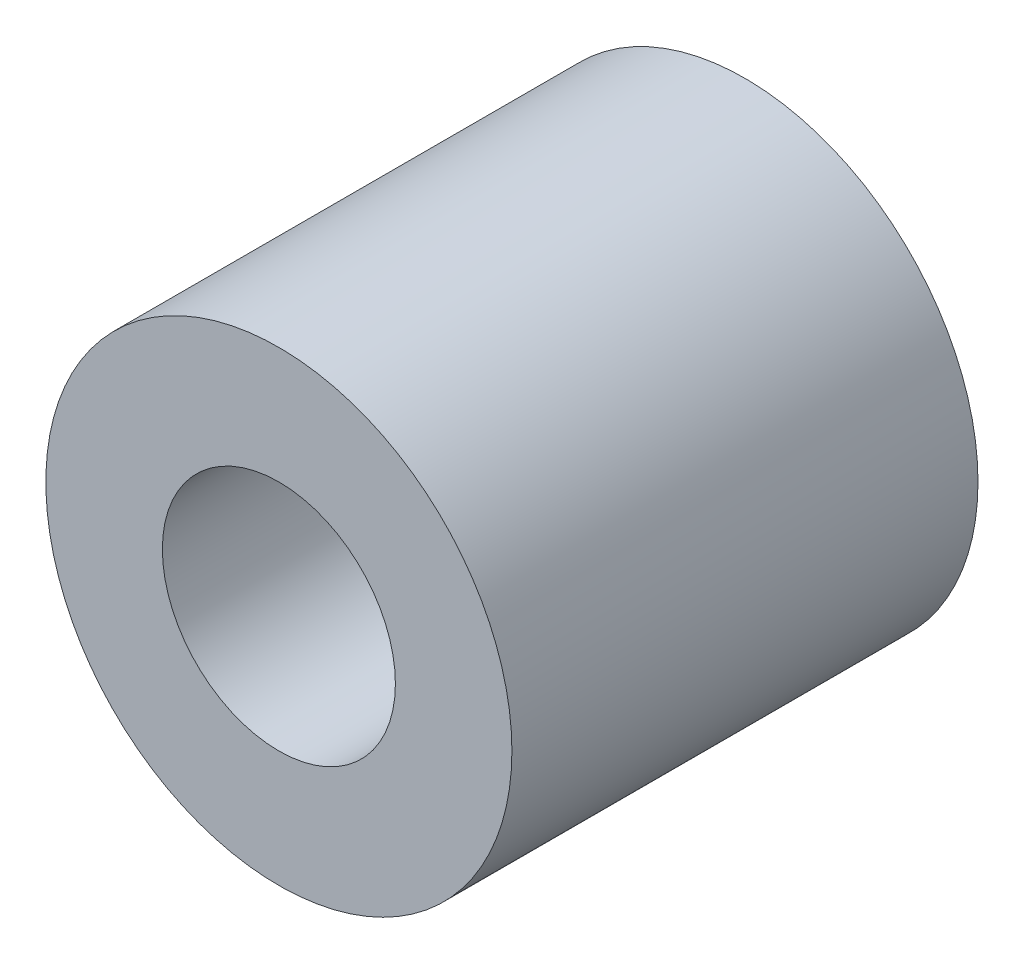
ISO-10303-21;
HEADER;
FILE_DESCRIPTION(('STEP AP214'),'2;1');
FILE_NAME('part.step','',(''),(''),'','','');
FILE_SCHEMA(('AUTOMOTIVE_DESIGN { 1 0 10303 214 1 1 1 1 }'));
ENDSEC;
DATA;
#1=APPLICATION_CONTEXT('core data for automotive mechanical design processes');
#2=APPLICATION_PROTOCOL_DEFINITION('international standard','automotive_design',2000,#1);
#3=PRODUCT_CONTEXT('',#1,'mechanical');
#4=PRODUCT('Part','Part','',(#3));
#5=PRODUCT_RELATED_PRODUCT_CATEGORY('part','',(#4));
#6=PRODUCT_DEFINITION_FORMATION('','',#4);
#7=PRODUCT_DEFINITION_CONTEXT('part definition',#1,'design');
#8=PRODUCT_DEFINITION('design','',#6,#7);
#9=PRODUCT_DEFINITION_SHAPE('','',#8);
#10=(LENGTH_UNIT() NAMED_UNIT(*) SI_UNIT(.MILLI.,.METRE.));
#11=(NAMED_UNIT(*) PLANE_ANGLE_UNIT() SI_UNIT($,.RADIAN.));
#12=(NAMED_UNIT(*) SI_UNIT($,.STERADIAN.) SOLID_ANGLE_UNIT());
#13=UNCERTAINTY_MEASURE_WITH_UNIT(LENGTH_MEASURE(1.E-05),#10,'distance_accuracy_value','');
#14=(GEOMETRIC_REPRESENTATION_CONTEXT(3) GLOBAL_UNCERTAINTY_ASSIGNED_CONTEXT((#13)) GLOBAL_UNIT_ASSIGNED_CONTEXT((#10,
#11,#12)) REPRESENTATION_CONTEXT('',''));
#15=CARTESIAN_POINT('',(0.,0.,0.));
#16=DIRECTION('',(0.,0.,1.));
#17=DIRECTION('',(1.,0.,0.));
#18=AXIS2_PLACEMENT_3D('',#15,#16,#17);
#19=CARTESIAN_POINT('',(0.,0.,-10.));
#20=DIRECTION('',(0.,0.,1.));
#21=DIRECTION('',(1.,0.,0.));
#22=AXIS2_PLACEMENT_3D('',#19,#20,#21);
#23=CYLINDRICAL_SURFACE('',#22,5.);
#24=CARTESIAN_POINT('',(0.,0.,-10.));
#25=DIRECTION('',(0.,0.,1.));
#26=DIRECTION('',(1.,0.,0.));
#27=AXIS2_PLACEMENT_3D('',#24,#25,#26);
#28=CIRCLE('',#27,5.);
#29=CARTESIAN_POINT('',(5.,0.,-10.));
#30=VERTEX_POINT('',#29);
#31=EDGE_CURVE('E10',#30,#30,#28,.T.);
#32=ORIENTED_EDGE('',*,*,#31,.T.);
#33=EDGE_LOOP('',(#32));
#34=FACE_BOUND('',#33,.T.);
#35=CARTESIAN_POINT('',(0.,0.,0.));
#36=DIRECTION('',(0.,0.,1.));
#37=DIRECTION('',(1.,0.,0.));
#38=AXIS2_PLACEMENT_3D('',#35,#36,#37);
#39=CIRCLE('',#38,5.);
#40=CARTESIAN_POINT('',(5.,0.,0.));
#41=VERTEX_POINT('',#40);
#42=EDGE_CURVE('E34',#41,#41,#39,.T.);
#43=ORIENTED_EDGE('',*,*,#42,.F.);
#44=EDGE_LOOP('',(#43));
#45=FACE_BOUND('',#44,.T.);
#46=ADVANCED_FACE('F31',(#34,#45),#23,.T.);
#47=CARTESIAN_POINT('',(0.,0.,-10.));
#48=DIRECTION('',(0.,0.,1.));
#49=DIRECTION('',(1.,0.,0.));
#50=AXIS2_PLACEMENT_3D('',#47,#48,#49);
#51=PLANE('',#50);
#52=CARTESIAN_POINT('',(0.,0.,-10.));
#53=DIRECTION('',(0.,0.,1.));
#54=DIRECTION('',(1.,0.,0.));
#55=AXIS2_PLACEMENT_3D('',#52,#53,#54);
#56=CIRCLE('',#55,2.5);
#57=CARTESIAN_POINT('',(2.5,0.,-10.));
#58=VERTEX_POINT('',#57);
#59=EDGE_CURVE('E41',#58,#58,#56,.T.);
#60=ORIENTED_EDGE('',*,*,#59,.T.);
#61=EDGE_LOOP('',(#60));
#62=FACE_BOUND('',#61,.T.);
#63=ORIENTED_EDGE('',*,*,#31,.F.);
#64=EDGE_LOOP('',(#63));
#65=FACE_BOUND('',#64,.T.);
#66=ADVANCED_FACE('F49',(#62,#65),#51,.F.);
#67=CARTESIAN_POINT('',(0.,0.,0.));
#68=DIRECTION('',(0.,0.,1.));
#69=DIRECTION('',(1.,0.,0.));
#70=AXIS2_PLACEMENT_3D('',#67,#68,#69);
#71=PLANE('',#70);
#72=CARTESIAN_POINT('',(0.,0.,0.));
#73=DIRECTION('',(0.,0.,1.));
#74=DIRECTION('',(1.,0.,0.));
#75=AXIS2_PLACEMENT_3D('',#72,#73,#74);
#76=CIRCLE('',#75,2.5);
#77=CARTESIAN_POINT('',(2.5,0.,0.));
#78=VERTEX_POINT('',#77);
#79=EDGE_CURVE('E43',#78,#78,#76,.T.);
#80=ORIENTED_EDGE('',*,*,#79,.F.);
#81=EDGE_LOOP('',(#80));
#82=FACE_BOUND('',#81,.T.);
#83=ORIENTED_EDGE('',*,*,#42,.T.);
#84=EDGE_LOOP('',(#83));
#85=FACE_BOUND('',#84,.T.);
#86=ADVANCED_FACE('F55',(#82,#85),#71,.T.);
#87=CARTESIAN_POINT('',(0.,0.,-10.));
#88=DIRECTION('',(0.,0.,1.));
#89=DIRECTION('',(1.,0.,0.));
#90=AXIS2_PLACEMENT_3D('',#87,#88,#89);
#91=CYLINDRICAL_SURFACE('',#90,2.5);
#92=ORIENTED_EDGE('',*,*,#59,.F.);
#93=EDGE_LOOP('',(#92));
#94=FACE_BOUND('',#93,.T.);
#95=ORIENTED_EDGE('',*,*,#79,.T.);
#96=EDGE_LOOP('',(#95));
#97=FACE_BOUND('',#96,.T.);
#98=ADVANCED_FACE('F52',(#94,#97),#91,.F.);
#99=CLOSED_SHELL('',(#46,#66,#86,#98));
#100=MANIFOLD_SOLID_BREP('B2',#99);
#101=ADVANCED_BREP_SHAPE_REPRESENTATION('',(#18,#100),#14);
#102=SHAPE_DEFINITION_REPRESENTATION(#9,#101);
ENDSEC;
END-ISO-10303-21;
